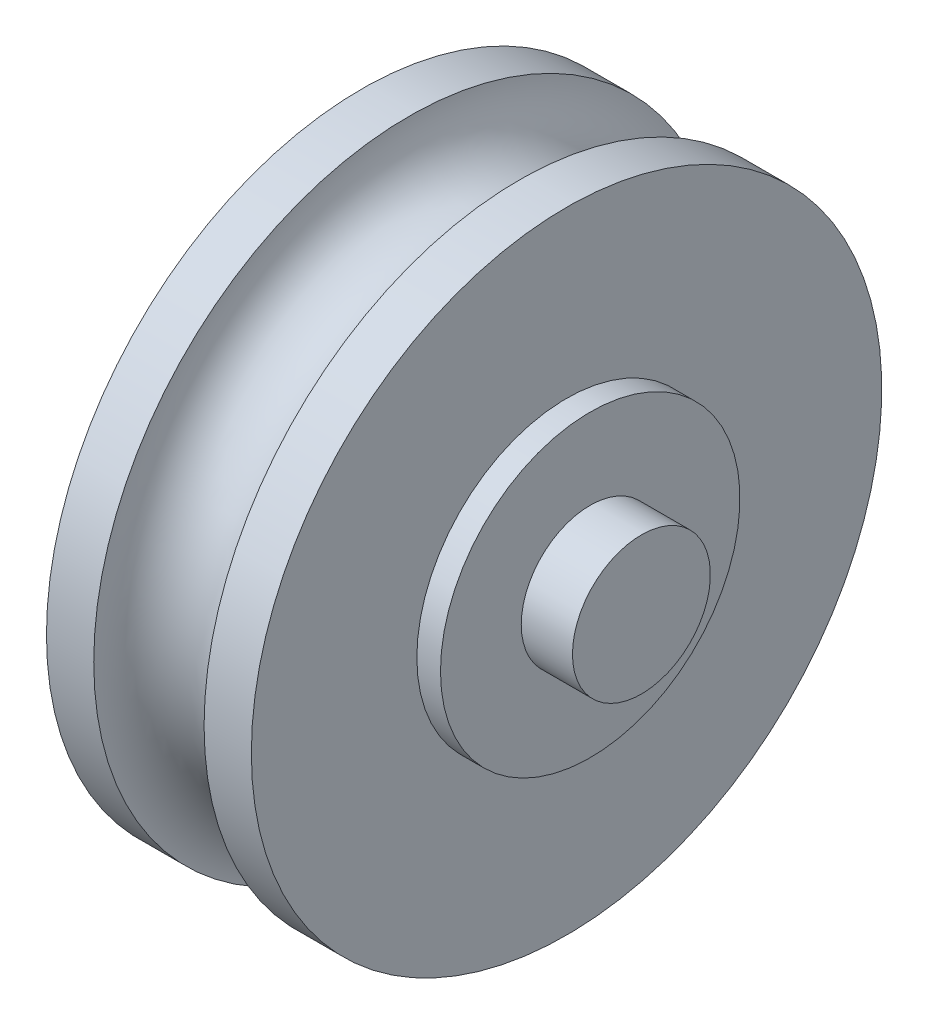
ISO-10303-21;
HEADER;
FILE_DESCRIPTION(('STEP AP214'),'2;1');
FILE_NAME('part.step','',(''),(''),'','','');
FILE_SCHEMA(('AUTOMOTIVE_DESIGN { 1 0 10303 214 1 1 1 1 }'));
ENDSEC;
DATA;
#1=APPLICATION_CONTEXT('core data for automotive mechanical design processes');
#2=APPLICATION_PROTOCOL_DEFINITION('international standard','automotive_design',2000,#1);
#3=PRODUCT_CONTEXT('',#1,'mechanical');
#4=PRODUCT('Part','Part','',(#3));
#5=PRODUCT_RELATED_PRODUCT_CATEGORY('part','',(#4));
#6=PRODUCT_DEFINITION_FORMATION('','',#4);
#7=PRODUCT_DEFINITION_CONTEXT('part definition',#1,'design');
#8=PRODUCT_DEFINITION('design','',#6,#7);
#9=PRODUCT_DEFINITION_SHAPE('','',#8);
#10=(LENGTH_UNIT() NAMED_UNIT(*) SI_UNIT(.MILLI.,.METRE.));
#11=(NAMED_UNIT(*) PLANE_ANGLE_UNIT() SI_UNIT($,.RADIAN.));
#12=(NAMED_UNIT(*) SI_UNIT($,.STERADIAN.) SOLID_ANGLE_UNIT());
#13=UNCERTAINTY_MEASURE_WITH_UNIT(LENGTH_MEASURE(1.E-05),#10,'distance_accuracy_value','');
#14=(GEOMETRIC_REPRESENTATION_CONTEXT(3) GLOBAL_UNCERTAINTY_ASSIGNED_CONTEXT((#13)) GLOBAL_UNIT_ASSIGNED_CONTEXT((#10,
#11,#12)) REPRESENTATION_CONTEXT('',''));
#15=CARTESIAN_POINT('',(0.,0.,0.));
#16=DIRECTION('',(0.,0.,1.));
#17=DIRECTION('',(1.,0.,0.));
#18=AXIS2_PLACEMENT_3D('',#15,#16,#17);
#19=CARTESIAN_POINT('',(0.,0.,0.));
#20=DIRECTION('',(-1.,0.,0.));
#21=DIRECTION('',(0.,0.,1.));
#22=AXIS2_PLACEMENT_3D('',#19,#20,#21);
#23=CYLINDRICAL_SURFACE('',#22,3.8);
#24=CARTESIAN_POINT('',(2.6,0.,0.));
#25=DIRECTION('',(-1.,0.,0.));
#26=DIRECTION('',(0.,0.,1.));
#27=AXIS2_PLACEMENT_3D('',#24,#25,#26);
#28=CIRCLE('',#27,3.8);
#29=CARTESIAN_POINT('',(2.6,0.,3.8));
#30=VERTEX_POINT('',#29);
#31=EDGE_CURVE('E71',#30,#30,#28,.T.);
#32=ORIENTED_EDGE('',*,*,#31,.F.);
#33=EDGE_LOOP('',(#32));
#34=FACE_BOUND('',#33,.T.);
#35=CARTESIAN_POINT('',(3.2,0.,0.));
#36=DIRECTION('',(-1.,0.,0.));
#37=DIRECTION('',(0.,0.,1.));
#38=AXIS2_PLACEMENT_3D('',#35,#36,#37);
#39=CIRCLE('',#38,3.8);
#40=CARTESIAN_POINT('',(3.2,0.,3.8));
#41=VERTEX_POINT('',#40);
#42=EDGE_CURVE('E10',#41,#41,#39,.T.);
#43=ORIENTED_EDGE('',*,*,#42,.T.);
#44=EDGE_LOOP('',(#43));
#45=FACE_BOUND('',#44,.T.);
#46=ADVANCED_FACE('F31',(#34,#45),#23,.T.);
#47=CARTESIAN_POINT('',(3.2,3.8,0.));
#48=DIRECTION('',(-1.,0.,0.));
#49=DIRECTION('',(0.,0.,1.));
#50=AXIS2_PLACEMENT_3D('',#47,#48,#49);
#51=PLANE('',#50);
#52=ORIENTED_EDGE('',*,*,#42,.F.);
#53=EDGE_LOOP('',(#52));
#54=FACE_BOUND('',#53,.T.);
#55=CARTESIAN_POINT('',(3.2,0.,0.));
#56=DIRECTION('',(-1.,0.,0.));
#57=DIRECTION('',(0.,0.,1.));
#58=AXIS2_PLACEMENT_3D('',#55,#56,#57);
#59=CIRCLE('',#58,1.75);
#60=CARTESIAN_POINT('',(3.2,0.,1.75));
#61=VERTEX_POINT('',#60);
#62=EDGE_CURVE('E37',#61,#61,#59,.T.);
#63=ORIENTED_EDGE('',*,*,#62,.T.);
#64=EDGE_LOOP('',(#63));
#65=FACE_BOUND('',#64,.T.);
#66=ADVANCED_FACE('F78',(#54,#65),#51,.F.);
#67=CARTESIAN_POINT('',(0.,0.,0.));
#68=DIRECTION('',(-1.,0.,0.));
#69=DIRECTION('',(0.,0.,1.));
#70=AXIS2_PLACEMENT_3D('',#67,#68,#69);
#71=CYLINDRICAL_SURFACE('',#70,1.75);
#72=ORIENTED_EDGE('',*,*,#62,.F.);
#73=EDGE_LOOP('',(#72));
#74=FACE_BOUND('',#73,.T.);
#75=CARTESIAN_POINT('',(4.5,0.,0.));
#76=DIRECTION('',(-1.,0.,0.));
#77=DIRECTION('',(0.,0.,1.));
#78=AXIS2_PLACEMENT_3D('',#75,#76,#77);
#79=CIRCLE('',#78,1.75);
#80=CARTESIAN_POINT('',(4.5,0.,1.75));
#81=VERTEX_POINT('',#80);
#82=EDGE_CURVE('E41',#81,#81,#79,.T.);
#83=ORIENTED_EDGE('',*,*,#82,.T.);
#84=EDGE_LOOP('',(#83));
#85=FACE_BOUND('',#84,.T.);
#86=ADVANCED_FACE('F82',(#74,#85),#71,.T.);
#87=CARTESIAN_POINT('',(4.5,1.75,0.));
#88=DIRECTION('',(-1.,0.,0.));
#89=DIRECTION('',(0.,0.,1.));
#90=AXIS2_PLACEMENT_3D('',#87,#88,#89);
#91=PLANE('',#90);
#92=ORIENTED_EDGE('',*,*,#82,.F.);
#93=EDGE_LOOP('',(#92));
#94=FACE_BOUND('',#93,.T.);
#95=ADVANCED_FACE('F87',(#94),#91,.F.);
#96=CARTESIAN_POINT('',(-4.5,1.75,0.));
#97=DIRECTION('',(1.,0.,0.));
#98=DIRECTION('',(0.,0.,-1.));
#99=AXIS2_PLACEMENT_3D('',#96,#97,#98);
#100=PLANE('',#99);
#101=CARTESIAN_POINT('',(-4.5,0.,0.));
#102=DIRECTION('',(-1.,0.,0.));
#103=DIRECTION('',(0.,0.,1.));
#104=AXIS2_PLACEMENT_3D('',#101,#102,#103);
#105=CIRCLE('',#104,1.75);
#106=CARTESIAN_POINT('',(-4.5,0.,1.75));
#107=VERTEX_POINT('',#106);
#108=EDGE_CURVE('E45',#107,#107,#105,.T.);
#109=ORIENTED_EDGE('',*,*,#108,.T.);
#110=EDGE_LOOP('',(#109));
#111=FACE_BOUND('',#110,.T.);
#112=ADVANCED_FACE('F93',(#111),#100,.F.);
#113=CARTESIAN_POINT('',(0.,0.,0.));
#114=DIRECTION('',(-1.,0.,0.));
#115=DIRECTION('',(0.,0.,1.));
#116=AXIS2_PLACEMENT_3D('',#113,#114,#115);
#117=CYLINDRICAL_SURFACE('',#116,1.75);
#118=ORIENTED_EDGE('',*,*,#108,.F.);
#119=EDGE_LOOP('',(#118));
#120=FACE_BOUND('',#119,.T.);
#121=CARTESIAN_POINT('',(-3.2,0.,0.));
#122=DIRECTION('',(-1.,0.,0.));
#123=DIRECTION('',(0.,0.,1.));
#124=AXIS2_PLACEMENT_3D('',#121,#122,#123);
#125=CIRCLE('',#124,1.75);
#126=CARTESIAN_POINT('',(-3.2,0.,1.75));
#127=VERTEX_POINT('',#126);
#128=EDGE_CURVE('E50',#127,#127,#125,.T.);
#129=ORIENTED_EDGE('',*,*,#128,.T.);
#130=EDGE_LOOP('',(#129));
#131=FACE_BOUND('',#130,.T.);
#132=ADVANCED_FACE('F97',(#120,#131),#117,.T.);
#133=CARTESIAN_POINT('',(-3.2,3.8,0.));
#134=DIRECTION('',(1.,0.,0.));
#135=DIRECTION('',(0.,0.,-1.));
#136=AXIS2_PLACEMENT_3D('',#133,#134,#135);
#137=PLANE('',#136);
#138=ORIENTED_EDGE('',*,*,#128,.F.);
#139=EDGE_LOOP('',(#138));
#140=FACE_BOUND('',#139,.T.);
#141=CARTESIAN_POINT('',(-3.2,0.,0.));
#142=DIRECTION('',(-1.,0.,0.));
#143=DIRECTION('',(0.,0.,1.));
#144=AXIS2_PLACEMENT_3D('',#141,#142,#143);
#145=CIRCLE('',#144,3.8);
#146=CARTESIAN_POINT('',(-3.2,0.,3.8));
#147=VERTEX_POINT('',#146);
#148=EDGE_CURVE('E53',#147,#147,#145,.T.);
#149=ORIENTED_EDGE('',*,*,#148,.T.);
#150=EDGE_LOOP('',(#149));
#151=FACE_BOUND('',#150,.T.);
#152=ADVANCED_FACE('F101',(#140,#151),#137,.F.);
#153=CARTESIAN_POINT('',(0.,0.,0.));
#154=DIRECTION('',(-1.,0.,0.));
#155=DIRECTION('',(0.,0.,1.));
#156=AXIS2_PLACEMENT_3D('',#153,#154,#155);
#157=CYLINDRICAL_SURFACE('',#156,3.8);
#158=ORIENTED_EDGE('',*,*,#148,.F.);
#159=EDGE_LOOP('',(#158));
#160=FACE_BOUND('',#159,.T.);
#161=CARTESIAN_POINT('',(-2.6,0.,0.));
#162=DIRECTION('',(-1.,0.,0.));
#163=DIRECTION('',(0.,0.,1.));
#164=AXIS2_PLACEMENT_3D('',#161,#162,#163);
#165=CIRCLE('',#164,3.8);
#166=CARTESIAN_POINT('',(-2.6,0.,3.8));
#167=VERTEX_POINT('',#166);
#168=EDGE_CURVE('E56',#167,#167,#165,.T.);
#169=ORIENTED_EDGE('',*,*,#168,.T.);
#170=EDGE_LOOP('',(#169));
#171=FACE_BOUND('',#170,.T.);
#172=ADVANCED_FACE('F105',(#160,#171),#157,.T.);
#173=CARTESIAN_POINT('',(-2.6,3.8,0.));
#174=DIRECTION('',(1.,0.,0.));
#175=DIRECTION('',(0.,0.,-1.));
#176=AXIS2_PLACEMENT_3D('',#173,#174,#175);
#177=PLANE('',#176);
#178=ORIENTED_EDGE('',*,*,#168,.F.);
#179=EDGE_LOOP('',(#178));
#180=FACE_BOUND('',#179,.T.);
#181=CARTESIAN_POINT('',(-2.6,0.,0.));
#182=DIRECTION('',(-1.,0.,0.));
#183=DIRECTION('',(0.,0.,1.));
#184=AXIS2_PLACEMENT_3D('',#181,#182,#183);
#185=CIRCLE('',#184,8.);
#186=CARTESIAN_POINT('',(-2.6,0.,8.));
#187=VERTEX_POINT('',#186);
#188=EDGE_CURVE('E59',#187,#187,#185,.T.);
#189=ORIENTED_EDGE('',*,*,#188,.T.);
#190=EDGE_LOOP('',(#189));
#191=FACE_BOUND('',#190,.T.);
#192=ADVANCED_FACE('F109',(#180,#191),#177,.F.);
#193=CARTESIAN_POINT('',(0.,0.,0.));
#194=DIRECTION('',(-1.,0.,0.));
#195=DIRECTION('',(0.,0.,1.));
#196=AXIS2_PLACEMENT_3D('',#193,#194,#195);
#197=CYLINDRICAL_SURFACE('',#196,8.);
#198=ORIENTED_EDGE('',*,*,#188,.F.);
#199=EDGE_LOOP('',(#198));
#200=FACE_BOUND('',#199,.T.);
#201=CARTESIAN_POINT('',(-1.4,0.,0.));
#202=DIRECTION('',(-1.,0.,0.));
#203=DIRECTION('',(0.,0.,1.));
#204=AXIS2_PLACEMENT_3D('',#201,#202,#203);
#205=CIRCLE('',#204,8.);
#206=CARTESIAN_POINT('',(-1.4,0.,8.));
#207=VERTEX_POINT('',#206);
#208=EDGE_CURVE('E62',#207,#207,#205,.T.);
#209=ORIENTED_EDGE('',*,*,#208,.T.);
#210=EDGE_LOOP('',(#209));
#211=FACE_BOUND('',#210,.T.);
#212=ADVANCED_FACE('F113',(#200,#211),#197,.T.);
#213=CARTESIAN_POINT('',(0.,0.,0.));
#214=DIRECTION('',(-1.,0.,0.));
#215=DIRECTION('',(0.,0.,1.));
#216=AXIS2_PLACEMENT_3D('',#213,#214,#215);
#217=TOROIDAL_SURFACE('',#216,8.,1.4);
#218=ORIENTED_EDGE('',*,*,#208,.F.);
#219=EDGE_LOOP('',(#218));
#220=FACE_BOUND('',#219,.T.);
#221=CARTESIAN_POINT('',(1.4,0.,0.));
#222=DIRECTION('',(-1.,0.,0.));
#223=DIRECTION('',(0.,0.,1.));
#224=AXIS2_PLACEMENT_3D('',#221,#222,#223);
#225=CIRCLE('',#224,8.);
#226=CARTESIAN_POINT('',(1.4,0.,8.));
#227=VERTEX_POINT('',#226);
#228=EDGE_CURVE('E65',#227,#227,#225,.T.);
#229=ORIENTED_EDGE('',*,*,#228,.T.);
#230=EDGE_LOOP('',(#229));
#231=FACE_BOUND('',#230,.T.);
#232=ADVANCED_FACE('F117',(#220,#231),#217,.F.);
#233=CARTESIAN_POINT('',(0.,0.,0.));
#234=DIRECTION('',(-1.,0.,0.));
#235=DIRECTION('',(0.,0.,1.));
#236=AXIS2_PLACEMENT_3D('',#233,#234,#235);
#237=CYLINDRICAL_SURFACE('',#236,8.);
#238=ORIENTED_EDGE('',*,*,#228,.F.);
#239=EDGE_LOOP('',(#238));
#240=FACE_BOUND('',#239,.T.);
#241=CARTESIAN_POINT('',(2.6,0.,0.));
#242=DIRECTION('',(-1.,0.,0.));
#243=DIRECTION('',(0.,0.,1.));
#244=AXIS2_PLACEMENT_3D('',#241,#242,#243);
#245=CIRCLE('',#244,8.);
#246=CARTESIAN_POINT('',(2.6,0.,8.));
#247=VERTEX_POINT('',#246);
#248=EDGE_CURVE('E68',#247,#247,#245,.T.);
#249=ORIENTED_EDGE('',*,*,#248,.T.);
#250=EDGE_LOOP('',(#249));
#251=FACE_BOUND('',#250,.T.);
#252=ADVANCED_FACE('F121',(#240,#251),#237,.T.);
#253=CARTESIAN_POINT('',(2.6,3.8,0.));
#254=DIRECTION('',(-1.,0.,0.));
#255=DIRECTION('',(0.,0.,1.));
#256=AXIS2_PLACEMENT_3D('',#253,#254,#255);
#257=PLANE('',#256);
#258=ORIENTED_EDGE('',*,*,#248,.F.);
#259=EDGE_LOOP('',(#258));
#260=FACE_BOUND('',#259,.T.);
#261=ORIENTED_EDGE('',*,*,#31,.T.);
#262=EDGE_LOOP('',(#261));
#263=FACE_BOUND('',#262,.T.);
#264=ADVANCED_FACE('F75',(#260,#263),#257,.F.);
#265=CLOSED_SHELL('',(#46,#66,#86,#95,#112,#132,#152,#172,#192,#212,#232,#252,#264));
#266=MANIFOLD_SOLID_BREP('B2',#265);
#267=ADVANCED_BREP_SHAPE_REPRESENTATION('',(#18,#266),#14);
#268=SHAPE_DEFINITION_REPRESENTATION(#9,#267);
ENDSEC;
END-ISO-10303-21;
